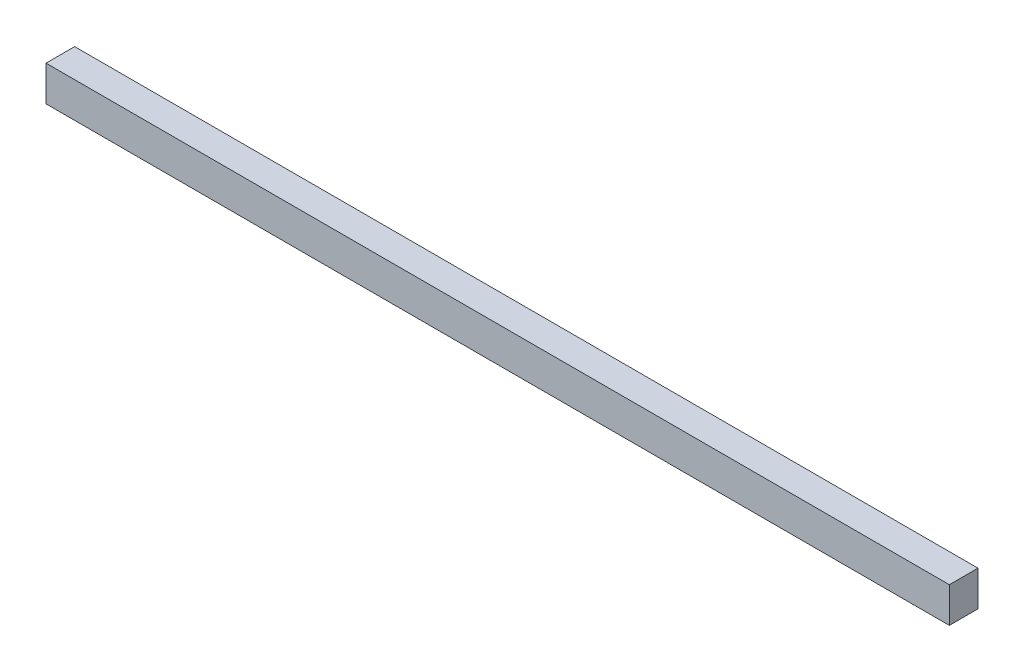
ISO-10303-21;
HEADER;
FILE_DESCRIPTION(('STEP AP214'),'2;1');
FILE_NAME('part.step','',(''),(''),'','','');
FILE_SCHEMA(('AUTOMOTIVE_DESIGN { 1 0 10303 214 1 1 1 1 }'));
ENDSEC;
DATA;
#1=APPLICATION_CONTEXT('core data for automotive mechanical design processes');
#2=APPLICATION_PROTOCOL_DEFINITION('international standard','automotive_design',2000,#1);
#3=PRODUCT_CONTEXT('',#1,'mechanical');
#4=PRODUCT('Part','Part','',(#3));
#5=PRODUCT_RELATED_PRODUCT_CATEGORY('part','',(#4));
#6=PRODUCT_DEFINITION_FORMATION('','',#4);
#7=PRODUCT_DEFINITION_CONTEXT('part definition',#1,'design');
#8=PRODUCT_DEFINITION('design','',#6,#7);
#9=PRODUCT_DEFINITION_SHAPE('','',#8);
#10=(LENGTH_UNIT() NAMED_UNIT(*) SI_UNIT(.MILLI.,.METRE.));
#11=(NAMED_UNIT(*) PLANE_ANGLE_UNIT() SI_UNIT($,.RADIAN.));
#12=(NAMED_UNIT(*) SI_UNIT($,.STERADIAN.) SOLID_ANGLE_UNIT());
#13=UNCERTAINTY_MEASURE_WITH_UNIT(LENGTH_MEASURE(1.E-05),#10,'distance_accuracy_value','');
#14=(GEOMETRIC_REPRESENTATION_CONTEXT(3) GLOBAL_UNCERTAINTY_ASSIGNED_CONTEXT((#13)) GLOBAL_UNIT_ASSIGNED_CONTEXT((#10,
#11,#12)) REPRESENTATION_CONTEXT('',''));
#15=CARTESIAN_POINT('',(0.,0.,0.));
#16=DIRECTION('',(0.,0.,1.));
#17=DIRECTION('',(1.,0.,0.));
#18=AXIS2_PLACEMENT_3D('',#15,#16,#17);
#19=CARTESIAN_POINT('',(205.,-8.,-13.));
#20=DIRECTION('',(1.,0.,0.));
#21=DIRECTION('',(0.,0.,-1.));
#22=AXIS2_PLACEMENT_3D('',#19,#20,#21);
#23=PLANE('',#22);
#24=DIRECTION('',(0.,1.,0.));
#25=VECTOR('',#24,1.);
#26=CARTESIAN_POINT('',(205.,-8.,0.));
#27=LINE('',#26,#25);
#28=CARTESIAN_POINT('',(205.,-8.,0.));
#29=VERTEX_POINT('',#28);
#30=CARTESIAN_POINT('',(205.,8.,0.));
#31=VERTEX_POINT('',#30);
#32=EDGE_CURVE('E97',#29,#31,#27,.T.);
#33=ORIENTED_EDGE('',*,*,#32,.F.);
#34=DIRECTION('',(0.,0.,1.));
#35=VECTOR('',#34,1.);
#36=CARTESIAN_POINT('',(205.,-8.,-13.));
#37=LINE('',#36,#35);
#38=CARTESIAN_POINT('',(205.,-8.,-13.));
#39=VERTEX_POINT('',#38);
#40=EDGE_CURVE('E11',#39,#29,#37,.T.);
#41=ORIENTED_EDGE('',*,*,#40,.F.);
#42=DIRECTION('',(0.,1.,0.));
#43=VECTOR('',#42,1.);
#44=CARTESIAN_POINT('',(205.,-8.,-13.));
#45=LINE('',#44,#43);
#46=CARTESIAN_POINT('',(205.,8.,-13.));
#47=VERTEX_POINT('',#46);
#48=EDGE_CURVE('E91',#39,#47,#45,.T.);
#49=ORIENTED_EDGE('',*,*,#48,.T.);
#50=DIRECTION('',(0.,0.,1.));
#51=VECTOR('',#50,1.);
#52=CARTESIAN_POINT('',(205.,8.,-13.));
#53=LINE('',#52,#51);
#54=EDGE_CURVE('E36',#47,#31,#53,.T.);
#55=ORIENTED_EDGE('',*,*,#54,.T.);
#56=EDGE_LOOP('',(#33,#41,#49,#55));
#57=FACE_BOUND('',#56,.T.);
#58=ADVANCED_FACE('F33',(#57),#23,.T.);
#59=CARTESIAN_POINT('',(-205.,-8.,-13.));
#60=DIRECTION('',(0.,-1.,0.));
#61=DIRECTION('',(0.,0.,-1.));
#62=AXIS2_PLACEMENT_3D('',#59,#60,#61);
#63=PLANE('',#62);
#64=DIRECTION('',(1.,0.,0.));
#65=VECTOR('',#64,1.);
#66=CARTESIAN_POINT('',(-205.,-8.,0.));
#67=LINE('',#66,#65);
#68=CARTESIAN_POINT('',(-205.,-8.,0.));
#69=VERTEX_POINT('',#68);
#70=EDGE_CURVE('E93',#69,#29,#67,.T.);
#71=ORIENTED_EDGE('',*,*,#70,.F.);
#72=DIRECTION('',(0.,0.,1.));
#73=VECTOR('',#72,1.);
#74=CARTESIAN_POINT('',(-205.,-8.,-13.));
#75=LINE('',#74,#73);
#76=CARTESIAN_POINT('',(-205.,-8.,-13.));
#77=VERTEX_POINT('',#76);
#78=EDGE_CURVE('E42',#77,#69,#75,.T.);
#79=ORIENTED_EDGE('',*,*,#78,.F.);
#80=DIRECTION('',(1.,0.,0.));
#81=VECTOR('',#80,1.);
#82=CARTESIAN_POINT('',(-205.,-8.,-13.));
#83=LINE('',#82,#81);
#84=EDGE_CURVE('E88',#77,#39,#83,.T.);
#85=ORIENTED_EDGE('',*,*,#84,.T.);
#86=ORIENTED_EDGE('',*,*,#40,.T.);
#87=EDGE_LOOP('',(#71,#79,#85,#86));
#88=FACE_BOUND('',#87,.T.);
#89=ADVANCED_FACE('F107',(#88),#63,.T.);
#90=CARTESIAN_POINT('',(-205.,-8.,-13.));
#91=DIRECTION('',(-1.,0.,0.));
#92=DIRECTION('',(0.,0.,1.));
#93=AXIS2_PLACEMENT_3D('',#90,#91,#92);
#94=PLANE('',#93);
#95=DIRECTION('',(0.,-1.,0.));
#96=VECTOR('',#95,1.);
#97=CARTESIAN_POINT('',(-205.,-8.,0.));
#98=LINE('',#97,#96);
#99=CARTESIAN_POINT('',(-205.,8.,0.));
#100=VERTEX_POINT('',#99);
#101=EDGE_CURVE('E83',#100,#69,#98,.T.);
#102=ORIENTED_EDGE('',*,*,#101,.F.);
#103=DIRECTION('',(0.,0.,1.));
#104=VECTOR('',#103,1.);
#105=CARTESIAN_POINT('',(-205.,8.,-13.));
#106=LINE('',#105,#104);
#107=CARTESIAN_POINT('',(-205.,8.,-13.));
#108=VERTEX_POINT('',#107);
#109=EDGE_CURVE('E78',#108,#100,#106,.T.);
#110=ORIENTED_EDGE('',*,*,#109,.F.);
#111=DIRECTION('',(0.,-1.,0.));
#112=VECTOR('',#111,1.);
#113=CARTESIAN_POINT('',(-205.,-8.,-13.));
#114=LINE('',#113,#112);
#115=EDGE_CURVE('E81',#108,#77,#114,.T.);
#116=ORIENTED_EDGE('',*,*,#115,.T.);
#117=ORIENTED_EDGE('',*,*,#78,.T.);
#118=EDGE_LOOP('',(#102,#110,#116,#117));
#119=FACE_BOUND('',#118,.T.);
#120=ADVANCED_FACE('F80',(#119),#94,.T.);
#121=CARTESIAN_POINT('',(-205.,8.,-13.));
#122=DIRECTION('',(0.,1.,0.));
#123=DIRECTION('',(0.,0.,1.));
#124=AXIS2_PLACEMENT_3D('',#121,#122,#123);
#125=PLANE('',#124);
#126=DIRECTION('',(-1.,0.,0.));
#127=VECTOR('',#126,1.);
#128=CARTESIAN_POINT('',(-205.,8.,0.));
#129=LINE('',#128,#127);
#130=EDGE_CURVE('E100',#31,#100,#129,.T.);
#131=ORIENTED_EDGE('',*,*,#130,.F.);
#132=ORIENTED_EDGE('',*,*,#54,.F.);
#133=DIRECTION('',(-1.,0.,0.));
#134=VECTOR('',#133,1.);
#135=CARTESIAN_POINT('',(-205.,8.,-13.));
#136=LINE('',#135,#134);
#137=EDGE_CURVE('E87',#47,#108,#136,.T.);
#138=ORIENTED_EDGE('',*,*,#137,.T.);
#139=ORIENTED_EDGE('',*,*,#109,.T.);
#140=EDGE_LOOP('',(#131,#132,#138,#139));
#141=FACE_BOUND('',#140,.T.);
#142=ADVANCED_FACE('F90',(#141),#125,.T.);
#143=CARTESIAN_POINT('',(0.,0.,-13.));
#144=DIRECTION('',(0.,0.,-1.));
#145=DIRECTION('',(-1.,0.,0.));
#146=AXIS2_PLACEMENT_3D('',#143,#144,#145);
#147=PLANE('',#146);
#148=ORIENTED_EDGE('',*,*,#48,.F.);
#149=ORIENTED_EDGE('',*,*,#84,.F.);
#150=ORIENTED_EDGE('',*,*,#115,.F.);
#151=ORIENTED_EDGE('',*,*,#137,.F.);
#152=EDGE_LOOP('',(#148,#149,#150,#151));
#153=FACE_BOUND('',#152,.T.);
#154=ADVANCED_FACE('F86',(#153),#147,.T.);
#155=CARTESIAN_POINT('',(0.,0.,0.));
#156=DIRECTION('',(0.,0.,-1.));
#157=DIRECTION('',(-1.,0.,0.));
#158=AXIS2_PLACEMENT_3D('',#155,#156,#157);
#159=PLANE('',#158);
#160=ORIENTED_EDGE('',*,*,#32,.T.);
#161=ORIENTED_EDGE('',*,*,#130,.T.);
#162=ORIENTED_EDGE('',*,*,#101,.T.);
#163=ORIENTED_EDGE('',*,*,#70,.T.);
#164=EDGE_LOOP('',(#160,#161,#162,#163));
#165=FACE_BOUND('',#164,.T.);
#166=ADVANCED_FACE('F106',(#165),#159,.F.);
#167=CLOSED_SHELL('',(#58,#89,#120,#142,#154,#166));
#168=MANIFOLD_SOLID_BREP('B2',#167);
#169=ADVANCED_BREP_SHAPE_REPRESENTATION('',(#18,#168),#14);
#170=SHAPE_DEFINITION_REPRESENTATION(#9,#169);
ENDSEC;
END-ISO-10303-21;
